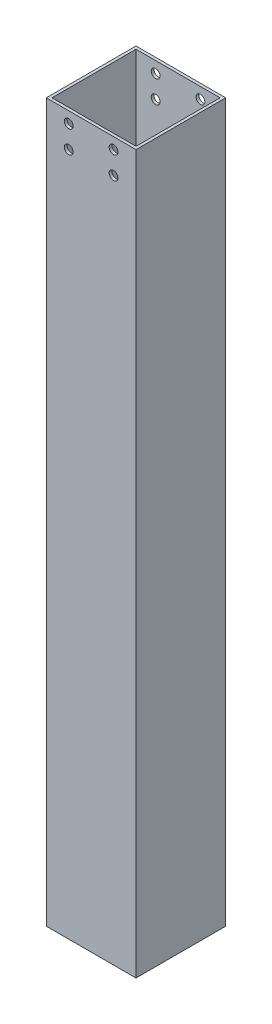
ISO-10303-21;
HEADER;
FILE_DESCRIPTION(('STEP AP214'),'2;1');
FILE_NAME('part.step','',(''),(''),'','','');
FILE_SCHEMA(('AUTOMOTIVE_DESIGN { 1 0 10303 214 1 1 1 1 }'));
ENDSEC;
DATA;
#1=APPLICATION_CONTEXT('core data for automotive mechanical design processes');
#2=APPLICATION_PROTOCOL_DEFINITION('international standard','automotive_design',2000,#1);
#3=PRODUCT_CONTEXT('',#1,'mechanical');
#4=PRODUCT('Part','Part','',(#3));
#5=PRODUCT_RELATED_PRODUCT_CATEGORY('part','',(#4));
#6=PRODUCT_DEFINITION_FORMATION('','',#4);
#7=PRODUCT_DEFINITION_CONTEXT('part definition',#1,'design');
#8=PRODUCT_DEFINITION('design','',#6,#7);
#9=PRODUCT_DEFINITION_SHAPE('','',#8);
#10=(LENGTH_UNIT() NAMED_UNIT(*) SI_UNIT(.MILLI.,.METRE.));
#11=(NAMED_UNIT(*) PLANE_ANGLE_UNIT() SI_UNIT($,.RADIAN.));
#12=(NAMED_UNIT(*) SI_UNIT($,.STERADIAN.) SOLID_ANGLE_UNIT());
#13=UNCERTAINTY_MEASURE_WITH_UNIT(LENGTH_MEASURE(1.E-05),#10,'distance_accuracy_value','');
#14=(GEOMETRIC_REPRESENTATION_CONTEXT(3) GLOBAL_UNCERTAINTY_ASSIGNED_CONTEXT((#13)) GLOBAL_UNIT_ASSIGNED_CONTEXT((#10,
#11,#12)) REPRESENTATION_CONTEXT('',''));
#15=CARTESIAN_POINT('',(0.,0.,0.));
#16=DIRECTION('',(0.,0.,1.));
#17=DIRECTION('',(1.,0.,0.));
#18=AXIS2_PLACEMENT_3D('',#15,#16,#17);
#19=CARTESIAN_POINT('',(0.,406.4,-50.8));
#20=DIRECTION('',(0.,1.,0.));
#21=DIRECTION('',(0.,0.,1.));
#22=AXIS2_PLACEMENT_3D('',#19,#20,#21);
#23=PLANE('',#22);
#24=DIRECTION('',(-1.,0.,0.));
#25=VECTOR('',#24,1.);
#26=CARTESIAN_POINT('',(0.,406.4,0.));
#27=LINE('',#26,#25);
#28=CARTESIAN_POINT('',(50.8,406.4,0.));
#29=VERTEX_POINT('',#28);
#30=CARTESIAN_POINT('',(0.,406.4,0.));
#31=VERTEX_POINT('',#30);
#32=EDGE_CURVE('E145',#29,#31,#27,.T.);
#33=ORIENTED_EDGE('',*,*,#32,.F.);
#34=DIRECTION('',(0.,0.,1.));
#35=VECTOR('',#34,1.);
#36=CARTESIAN_POINT('',(50.8,406.4,-50.8));
#37=LINE('',#36,#35);
#38=CARTESIAN_POINT('',(50.8,406.4,-50.8));
#39=VERTEX_POINT('',#38);
#40=EDGE_CURVE('E48',#39,#29,#37,.T.);
#41=ORIENTED_EDGE('',*,*,#40,.F.);
#42=DIRECTION('',(-1.,0.,0.));
#43=VECTOR('',#42,1.);
#44=CARTESIAN_POINT('',(0.,406.4,-50.8));
#45=LINE('',#44,#43);
#46=CARTESIAN_POINT('',(0.,406.4,-50.8));
#47=VERTEX_POINT('',#46);
#48=EDGE_CURVE('E151',#39,#47,#45,.T.);
#49=ORIENTED_EDGE('',*,*,#48,.T.);
#50=DIRECTION('',(0.,0.,1.));
#51=VECTOR('',#50,1.);
#52=CARTESIAN_POINT('',(0.,406.4,-50.8));
#53=LINE('',#52,#51);
#54=EDGE_CURVE('E11',#47,#31,#53,.T.);
#55=ORIENTED_EDGE('',*,*,#54,.T.);
#56=EDGE_LOOP('',(#33,#41,#49,#55));
#57=FACE_BOUND('',#56,.T.);
#58=DIRECTION('',(0.,0.,1.));
#59=VECTOR('',#58,1.);
#60=CARTESIAN_POINT('',(49.2125,406.4,-50.8));
#61=LINE('',#60,#59);
#62=CARTESIAN_POINT('',(49.2125,406.4,-49.2125));
#63=VERTEX_POINT('',#62);
#64=CARTESIAN_POINT('',(49.2125,406.4,-1.5875));
#65=VERTEX_POINT('',#64);
#66=EDGE_CURVE('E115',#63,#65,#61,.T.);
#67=ORIENTED_EDGE('',*,*,#66,.T.);
#68=DIRECTION('',(-1.,0.,0.));
#69=VECTOR('',#68,1.);
#70=CARTESIAN_POINT('',(0.,406.4,-1.5875));
#71=LINE('',#70,#69);
#72=CARTESIAN_POINT('',(1.5875,406.4,-1.5875));
#73=VERTEX_POINT('',#72);
#74=EDGE_CURVE('E121',#65,#73,#71,.T.);
#75=ORIENTED_EDGE('',*,*,#74,.T.);
#76=DIRECTION('',(0.,0.,1.));
#77=VECTOR('',#76,1.);
#78=CARTESIAN_POINT('',(1.5875,406.4,-50.8));
#79=LINE('',#78,#77);
#80=CARTESIAN_POINT('',(1.5875,406.4,-49.2125));
#81=VERTEX_POINT('',#80);
#82=EDGE_CURVE('E106',#81,#73,#79,.T.);
#83=ORIENTED_EDGE('',*,*,#82,.F.);
#84=DIRECTION('',(-1.,0.,0.));
#85=VECTOR('',#84,1.);
#86=CARTESIAN_POINT('',(0.,406.4,-49.2125));
#87=LINE('',#86,#85);
#88=EDGE_CURVE('E56',#63,#81,#87,.T.);
#89=ORIENTED_EDGE('',*,*,#88,.F.);
#90=EDGE_LOOP('',(#67,#75,#83,#89));
#91=FACE_BOUND('',#90,.T.);
#92=ADVANCED_FACE('F39',(#57,#91),#23,.T.);
#93=CARTESIAN_POINT('',(0.,0.,-50.8));
#94=DIRECTION('',(0.,-1.,0.));
#95=DIRECTION('',(0.,0.,-1.));
#96=AXIS2_PLACEMENT_3D('',#93,#94,#95);
#97=PLANE('',#96);
#98=DIRECTION('',(1.,0.,0.));
#99=VECTOR('',#98,1.);
#100=CARTESIAN_POINT('',(0.,0.,0.));
#101=LINE('',#100,#99);
#102=CARTESIAN_POINT('',(0.,0.,0.));
#103=VERTEX_POINT('',#102);
#104=CARTESIAN_POINT('',(50.8,0.,0.));
#105=VERTEX_POINT('',#104);
#106=EDGE_CURVE('E157',#103,#105,#101,.T.);
#107=ORIENTED_EDGE('',*,*,#106,.F.);
#108=DIRECTION('',(0.,0.,1.));
#109=VECTOR('',#108,1.);
#110=CARTESIAN_POINT('',(0.,0.,-50.8));
#111=LINE('',#110,#109);
#112=CARTESIAN_POINT('',(0.,0.,-50.8));
#113=VERTEX_POINT('',#112);
#114=EDGE_CURVE('E154',#113,#103,#111,.T.);
#115=ORIENTED_EDGE('',*,*,#114,.F.);
#116=DIRECTION('',(1.,0.,0.));
#117=VECTOR('',#116,1.);
#118=CARTESIAN_POINT('',(0.,0.,-50.8));
#119=LINE('',#118,#117);
#120=CARTESIAN_POINT('',(50.8,0.,-50.8));
#121=VERTEX_POINT('',#120);
#122=EDGE_CURVE('E144',#113,#121,#119,.T.);
#123=ORIENTED_EDGE('',*,*,#122,.T.);
#124=DIRECTION('',(0.,0.,1.));
#125=VECTOR('',#124,1.);
#126=CARTESIAN_POINT('',(50.8,0.,-50.8));
#127=LINE('',#126,#125);
#128=EDGE_CURVE('E166',#121,#105,#127,.T.);
#129=ORIENTED_EDGE('',*,*,#128,.T.);
#130=EDGE_LOOP('',(#107,#115,#123,#129));
#131=FACE_BOUND('',#130,.T.);
#132=DIRECTION('',(0.,0.,1.));
#133=VECTOR('',#132,1.);
#134=CARTESIAN_POINT('',(1.5875,0.,-50.8));
#135=LINE('',#134,#133);
#136=CARTESIAN_POINT('',(1.5875,0.,-49.2125));
#137=VERTEX_POINT('',#136);
#138=CARTESIAN_POINT('',(1.5875,0.,-1.5875));
#139=VERTEX_POINT('',#138);
#140=EDGE_CURVE('E135',#137,#139,#135,.T.);
#141=ORIENTED_EDGE('',*,*,#140,.T.);
#142=DIRECTION('',(1.,0.,0.));
#143=VECTOR('',#142,1.);
#144=CARTESIAN_POINT('',(0.,0.,-1.5875));
#145=LINE('',#144,#143);
#146=CARTESIAN_POINT('',(49.2125,0.,-1.5875));
#147=VERTEX_POINT('',#146);
#148=EDGE_CURVE('E124',#139,#147,#145,.T.);
#149=ORIENTED_EDGE('',*,*,#148,.T.);
#150=DIRECTION('',(0.,0.,1.));
#151=VECTOR('',#150,1.);
#152=CARTESIAN_POINT('',(49.2125,0.,-50.8));
#153=LINE('',#152,#151);
#154=CARTESIAN_POINT('',(49.2125,0.,-49.2125));
#155=VERTEX_POINT('',#154);
#156=EDGE_CURVE('E133',#155,#147,#153,.T.);
#157=ORIENTED_EDGE('',*,*,#156,.F.);
#158=DIRECTION('',(1.,0.,0.));
#159=VECTOR('',#158,1.);
#160=CARTESIAN_POINT('',(0.,0.,-49.2125));
#161=LINE('',#160,#159);
#162=EDGE_CURVE('E61',#137,#155,#161,.T.);
#163=ORIENTED_EDGE('',*,*,#162,.F.);
#164=EDGE_LOOP('',(#141,#149,#157,#163));
#165=FACE_BOUND('',#164,.T.);
#166=ADVANCED_FACE('F198',(#131,#165),#97,.T.);
#167=CARTESIAN_POINT('',(0.,0.,-50.8));
#168=DIRECTION('',(-1.,0.,0.));
#169=DIRECTION('',(0.,0.,1.));
#170=AXIS2_PLACEMENT_3D('',#167,#168,#169);
#171=PLANE('',#170);
#172=DIRECTION('',(0.,-1.,0.));
#173=VECTOR('',#172,1.);
#174=CARTESIAN_POINT('',(0.,0.,0.));
#175=LINE('',#174,#173);
#176=EDGE_CURVE('E114',#31,#103,#175,.T.);
#177=ORIENTED_EDGE('',*,*,#176,.F.);
#178=ORIENTED_EDGE('',*,*,#54,.F.);
#179=DIRECTION('',(0.,-1.,0.));
#180=VECTOR('',#179,1.);
#181=CARTESIAN_POINT('',(0.,0.,-50.8));
#182=LINE('',#181,#180);
#183=EDGE_CURVE('E141',#47,#113,#182,.T.);
#184=ORIENTED_EDGE('',*,*,#183,.T.);
#185=ORIENTED_EDGE('',*,*,#114,.T.);
#186=EDGE_LOOP('',(#177,#178,#184,#185));
#187=FACE_BOUND('',#186,.T.);
#188=ADVANCED_FACE('F41',(#187),#171,.T.);
#189=CARTESIAN_POINT('',(50.8,0.,-50.8));
#190=DIRECTION('',(1.,0.,0.));
#191=DIRECTION('',(0.,0.,-1.));
#192=AXIS2_PLACEMENT_3D('',#189,#190,#191);
#193=PLANE('',#192);
#194=DIRECTION('',(0.,1.,0.));
#195=VECTOR('',#194,1.);
#196=CARTESIAN_POINT('',(50.8,0.,0.));
#197=LINE('',#196,#195);
#198=EDGE_CURVE('E160',#105,#29,#197,.T.);
#199=ORIENTED_EDGE('',*,*,#198,.F.);
#200=ORIENTED_EDGE('',*,*,#128,.F.);
#201=DIRECTION('',(0.,1.,0.));
#202=VECTOR('',#201,1.);
#203=CARTESIAN_POINT('',(50.8,0.,-50.8));
#204=LINE('',#203,#202);
#205=EDGE_CURVE('E148',#121,#39,#204,.T.);
#206=ORIENTED_EDGE('',*,*,#205,.T.);
#207=ORIENTED_EDGE('',*,*,#40,.T.);
#208=EDGE_LOOP('',(#199,#200,#206,#207));
#209=FACE_BOUND('',#208,.T.);
#210=ADVANCED_FACE('F205',(#209),#193,.T.);
#211=CARTESIAN_POINT('',(0.,0.,-50.8));
#212=DIRECTION('',(0.,0.,-1.));
#213=DIRECTION('',(-1.,0.,0.));
#214=AXIS2_PLACEMENT_3D('',#211,#212,#213);
#215=PLANE('',#214);
#216=CARTESIAN_POINT('',(12.7,387.35,-50.8));
#217=DIRECTION('',(0.,0.,1.));
#218=DIRECTION('',(1.,0.,0.));
#219=AXIS2_PLACEMENT_3D('',#216,#217,#218);
#220=CIRCLE('',#219,2.48920000000001);
#221=CARTESIAN_POINT('',(15.1892,387.35,-50.8));
#222=VERTEX_POINT('',#221);
#223=EDGE_CURVE('E281',#222,#222,#220,.T.);
#224=ORIENTED_EDGE('',*,*,#223,.T.);
#225=EDGE_LOOP('',(#224));
#226=FACE_BOUND('',#225,.T.);
#227=CARTESIAN_POINT('',(12.7,400.05,-50.8));
#228=DIRECTION('',(0.,0.,1.));
#229=DIRECTION('',(1.,0.,0.));
#230=AXIS2_PLACEMENT_3D('',#227,#228,#229);
#231=CIRCLE('',#230,2.48919999999998);
#232=CARTESIAN_POINT('',(15.1892,400.05,-50.8));
#233=VERTEX_POINT('',#232);
#234=EDGE_CURVE('E273',#233,#233,#231,.T.);
#235=ORIENTED_EDGE('',*,*,#234,.T.);
#236=EDGE_LOOP('',(#235));
#237=FACE_BOUND('',#236,.T.);
#238=CARTESIAN_POINT('',(38.1,400.05,-50.8));
#239=DIRECTION('',(0.,0.,1.));
#240=DIRECTION('',(1.,0.,0.));
#241=AXIS2_PLACEMENT_3D('',#238,#239,#240);
#242=CIRCLE('',#241,2.48919999999997);
#243=CARTESIAN_POINT('',(40.5892,400.05,-50.8));
#244=VERTEX_POINT('',#243);
#245=EDGE_CURVE('E264',#244,#244,#242,.T.);
#246=ORIENTED_EDGE('',*,*,#245,.T.);
#247=EDGE_LOOP('',(#246));
#248=FACE_BOUND('',#247,.T.);
#249=CARTESIAN_POINT('',(38.1,387.35,-50.8));
#250=DIRECTION('',(0.,0.,1.));
#251=DIRECTION('',(1.,0.,0.));
#252=AXIS2_PLACEMENT_3D('',#249,#250,#251);
#253=CIRCLE('',#252,2.4892);
#254=CARTESIAN_POINT('',(40.5892,387.35,-50.8));
#255=VERTEX_POINT('',#254);
#256=EDGE_CURVE('E173',#255,#255,#253,.T.);
#257=ORIENTED_EDGE('',*,*,#256,.T.);
#258=EDGE_LOOP('',(#257));
#259=FACE_BOUND('',#258,.T.);
#260=ORIENTED_EDGE('',*,*,#183,.F.);
#261=ORIENTED_EDGE('',*,*,#48,.F.);
#262=ORIENTED_EDGE('',*,*,#205,.F.);
#263=ORIENTED_EDGE('',*,*,#122,.F.);
#264=EDGE_LOOP('',(#260,#261,#262,#263));
#265=FACE_BOUND('',#264,.T.);
#266=ADVANCED_FACE('F212',(#226,#237,#248,#259,#265),#215,.T.);
#267=CARTESIAN_POINT('',(0.,0.,0.));
#268=DIRECTION('',(0.,0.,-1.));
#269=DIRECTION('',(-1.,0.,0.));
#270=AXIS2_PLACEMENT_3D('',#267,#268,#269);
#271=PLANE('',#270);
#272=CARTESIAN_POINT('',(12.7,387.35,0.));
#273=DIRECTION('',(0.,0.,1.));
#274=DIRECTION('',(1.,0.,0.));
#275=AXIS2_PLACEMENT_3D('',#272,#273,#274);
#276=CIRCLE('',#275,2.48920000000001);
#277=CARTESIAN_POINT('',(15.1892,387.35,0.));
#278=VERTEX_POINT('',#277);
#279=EDGE_CURVE('E278',#278,#278,#276,.T.);
#280=ORIENTED_EDGE('',*,*,#279,.F.);
#281=EDGE_LOOP('',(#280));
#282=FACE_BOUND('',#281,.T.);
#283=CARTESIAN_POINT('',(12.7,400.05,0.));
#284=DIRECTION('',(0.,0.,1.));
#285=DIRECTION('',(1.,0.,0.));
#286=AXIS2_PLACEMENT_3D('',#283,#284,#285);
#287=CIRCLE('',#286,2.48919999999998);
#288=CARTESIAN_POINT('',(15.1892,400.05,0.));
#289=VERTEX_POINT('',#288);
#290=EDGE_CURVE('E267',#289,#289,#287,.T.);
#291=ORIENTED_EDGE('',*,*,#290,.F.);
#292=EDGE_LOOP('',(#291));
#293=FACE_BOUND('',#292,.T.);
#294=CARTESIAN_POINT('',(38.1,400.05,0.));
#295=DIRECTION('',(0.,0.,1.));
#296=DIRECTION('',(1.,0.,0.));
#297=AXIS2_PLACEMENT_3D('',#294,#295,#296);
#298=CIRCLE('',#297,2.48919999999997);
#299=CARTESIAN_POINT('',(40.5892,400.05,0.));
#300=VERTEX_POINT('',#299);
#301=EDGE_CURVE('E266',#300,#300,#298,.T.);
#302=ORIENTED_EDGE('',*,*,#301,.F.);
#303=EDGE_LOOP('',(#302));
#304=FACE_BOUND('',#303,.T.);
#305=CARTESIAN_POINT('',(38.1,387.35,0.));
#306=DIRECTION('',(0.,0.,1.));
#307=DIRECTION('',(1.,0.,0.));
#308=AXIS2_PLACEMENT_3D('',#305,#306,#307);
#309=CIRCLE('',#308,2.4892);
#310=CARTESIAN_POINT('',(40.5892,387.35,0.));
#311=VERTEX_POINT('',#310);
#312=EDGE_CURVE('E270',#311,#311,#309,.T.);
#313=ORIENTED_EDGE('',*,*,#312,.F.);
#314=EDGE_LOOP('',(#313));
#315=FACE_BOUND('',#314,.T.);
#316=ORIENTED_EDGE('',*,*,#176,.T.);
#317=ORIENTED_EDGE('',*,*,#106,.T.);
#318=ORIENTED_EDGE('',*,*,#198,.T.);
#319=ORIENTED_EDGE('',*,*,#32,.T.);
#320=EDGE_LOOP('',(#316,#317,#318,#319));
#321=FACE_BOUND('',#320,.T.);
#322=ADVANCED_FACE('F215',(#282,#293,#304,#315,#321),#271,.F.);
#323=CARTESIAN_POINT('',(1.5875,0.,-50.8));
#324=DIRECTION('',(-1.,0.,0.));
#325=DIRECTION('',(0.,0.,1.));
#326=AXIS2_PLACEMENT_3D('',#323,#324,#325);
#327=PLANE('',#326);
#328=DIRECTION('',(0.,-1.,0.));
#329=VECTOR('',#328,1.);
#330=CARTESIAN_POINT('',(1.5875,0.,-1.5875));
#331=LINE('',#330,#329);
#332=EDGE_CURVE('E109',#73,#139,#331,.T.);
#333=ORIENTED_EDGE('',*,*,#332,.T.);
#334=ORIENTED_EDGE('',*,*,#140,.F.);
#335=DIRECTION('',(0.,-1.,0.));
#336=VECTOR('',#335,1.);
#337=CARTESIAN_POINT('',(1.5875,0.,-49.2125));
#338=LINE('',#337,#336);
#339=EDGE_CURVE('E111',#81,#137,#338,.T.);
#340=ORIENTED_EDGE('',*,*,#339,.F.);
#341=ORIENTED_EDGE('',*,*,#82,.T.);
#342=EDGE_LOOP('',(#333,#334,#340,#341));
#343=FACE_BOUND('',#342,.T.);
#344=ADVANCED_FACE('F108',(#343),#327,.F.);
#345=CARTESIAN_POINT('',(49.2125,0.,-50.8));
#346=DIRECTION('',(1.,0.,0.));
#347=DIRECTION('',(0.,0.,-1.));
#348=AXIS2_PLACEMENT_3D('',#345,#346,#347);
#349=PLANE('',#348);
#350=DIRECTION('',(0.,1.,0.));
#351=VECTOR('',#350,1.);
#352=CARTESIAN_POINT('',(49.2125,0.,-1.5875));
#353=LINE('',#352,#351);
#354=EDGE_CURVE('E127',#147,#65,#353,.T.);
#355=ORIENTED_EDGE('',*,*,#354,.T.);
#356=ORIENTED_EDGE('',*,*,#66,.F.);
#357=DIRECTION('',(0.,1.,0.));
#358=VECTOR('',#357,1.);
#359=CARTESIAN_POINT('',(49.2125,0.,-49.2125));
#360=LINE('',#359,#358);
#361=EDGE_CURVE('E136',#155,#63,#360,.T.);
#362=ORIENTED_EDGE('',*,*,#361,.F.);
#363=ORIENTED_EDGE('',*,*,#156,.T.);
#364=EDGE_LOOP('',(#355,#356,#362,#363));
#365=FACE_BOUND('',#364,.T.);
#366=ADVANCED_FACE('F196',(#365),#349,.F.);
#367=CARTESIAN_POINT('',(0.,0.,-49.2125));
#368=DIRECTION('',(0.,0.,-1.));
#369=DIRECTION('',(-1.,0.,0.));
#370=AXIS2_PLACEMENT_3D('',#367,#368,#369);
#371=PLANE('',#370);
#372=CARTESIAN_POINT('',(12.7,387.35,-49.2125));
#373=DIRECTION('',(0.,0.,-1.));
#374=DIRECTION('',(-1.,0.,0.));
#375=AXIS2_PLACEMENT_3D('',#372,#373,#374);
#376=CIRCLE('',#375,2.48920000000001);
#377=CARTESIAN_POINT('',(10.2108,387.35,-49.2125));
#378=VERTEX_POINT('',#377);
#379=EDGE_CURVE('E125',#378,#378,#376,.T.);
#380=ORIENTED_EDGE('',*,*,#379,.T.);
#381=EDGE_LOOP('',(#380));
#382=FACE_BOUND('',#381,.T.);
#383=CARTESIAN_POINT('',(12.7,400.05,-49.2125));
#384=DIRECTION('',(0.,0.,-1.));
#385=DIRECTION('',(-1.,0.,0.));
#386=AXIS2_PLACEMENT_3D('',#383,#384,#385);
#387=CIRCLE('',#386,2.48919999999998);
#388=CARTESIAN_POINT('',(10.2108,400.05,-49.2125));
#389=VERTEX_POINT('',#388);
#390=EDGE_CURVE('E179',#389,#389,#387,.T.);
#391=ORIENTED_EDGE('',*,*,#390,.T.);
#392=EDGE_LOOP('',(#391));
#393=FACE_BOUND('',#392,.T.);
#394=CARTESIAN_POINT('',(38.1,400.05,-49.2125));
#395=DIRECTION('',(0.,0.,-1.));
#396=DIRECTION('',(-1.,0.,0.));
#397=AXIS2_PLACEMENT_3D('',#394,#395,#396);
#398=CIRCLE('',#397,2.48919999999997);
#399=CARTESIAN_POINT('',(35.6108,400.05,-49.2125));
#400=VERTEX_POINT('',#399);
#401=EDGE_CURVE('E176',#400,#400,#398,.T.);
#402=ORIENTED_EDGE('',*,*,#401,.T.);
#403=EDGE_LOOP('',(#402));
#404=FACE_BOUND('',#403,.T.);
#405=CARTESIAN_POINT('',(38.1,387.35,-49.2125));
#406=DIRECTION('',(0.,0.,-1.));
#407=DIRECTION('',(-1.,0.,0.));
#408=AXIS2_PLACEMENT_3D('',#405,#406,#407);
#409=CIRCLE('',#408,2.4892);
#410=CARTESIAN_POINT('',(35.6108,387.35,-49.2125));
#411=VERTEX_POINT('',#410);
#412=EDGE_CURVE('E172',#411,#411,#409,.T.);
#413=ORIENTED_EDGE('',*,*,#412,.T.);
#414=EDGE_LOOP('',(#413));
#415=FACE_BOUND('',#414,.T.);
#416=ORIENTED_EDGE('',*,*,#339,.T.);
#417=ORIENTED_EDGE('',*,*,#162,.T.);
#418=ORIENTED_EDGE('',*,*,#361,.T.);
#419=ORIENTED_EDGE('',*,*,#88,.T.);
#420=EDGE_LOOP('',(#416,#417,#418,#419));
#421=FACE_BOUND('',#420,.T.);
#422=ADVANCED_FACE('F193',(#382,#393,#404,#415,#421),#371,.F.);
#423=CARTESIAN_POINT('',(0.,0.,-1.5875));
#424=DIRECTION('',(0.,0.,-1.));
#425=DIRECTION('',(-1.,0.,0.));
#426=AXIS2_PLACEMENT_3D('',#423,#424,#425);
#427=PLANE('',#426);
#428=CARTESIAN_POINT('',(12.7,387.35,-1.5875));
#429=DIRECTION('',(0.,0.,-1.));
#430=DIRECTION('',(-1.,0.,0.));
#431=AXIS2_PLACEMENT_3D('',#428,#429,#430);
#432=CIRCLE('',#431,2.48920000000001);
#433=CARTESIAN_POINT('',(10.2108,387.35,-1.5875));
#434=VERTEX_POINT('',#433);
#435=EDGE_CURVE('E43',#434,#434,#432,.T.);
#436=ORIENTED_EDGE('',*,*,#435,.F.);
#437=EDGE_LOOP('',(#436));
#438=FACE_BOUND('',#437,.T.);
#439=CARTESIAN_POINT('',(12.7,400.05,-1.5875));
#440=DIRECTION('',(0.,0.,-1.));
#441=DIRECTION('',(-1.,0.,0.));
#442=AXIS2_PLACEMENT_3D('',#439,#440,#441);
#443=CIRCLE('',#442,2.48919999999998);
#444=CARTESIAN_POINT('',(10.2108,400.05,-1.5875));
#445=VERTEX_POINT('',#444);
#446=EDGE_CURVE('E177',#445,#445,#443,.T.);
#447=ORIENTED_EDGE('',*,*,#446,.F.);
#448=EDGE_LOOP('',(#447));
#449=FACE_BOUND('',#448,.T.);
#450=CARTESIAN_POINT('',(38.1,400.05,-1.5875));
#451=DIRECTION('',(0.,0.,-1.));
#452=DIRECTION('',(-1.,0.,0.));
#453=AXIS2_PLACEMENT_3D('',#450,#451,#452);
#454=CIRCLE('',#453,2.48919999999997);
#455=CARTESIAN_POINT('',(35.6108,400.05,-1.5875));
#456=VERTEX_POINT('',#455);
#457=EDGE_CURVE('E174',#456,#456,#454,.T.);
#458=ORIENTED_EDGE('',*,*,#457,.F.);
#459=EDGE_LOOP('',(#458));
#460=FACE_BOUND('',#459,.T.);
#461=CARTESIAN_POINT('',(38.1,387.35,-1.5875));
#462=DIRECTION('',(0.,0.,-1.));
#463=DIRECTION('',(-1.,0.,0.));
#464=AXIS2_PLACEMENT_3D('',#461,#462,#463);
#465=CIRCLE('',#464,2.4892);
#466=CARTESIAN_POINT('',(35.6108,387.35,-1.5875));
#467=VERTEX_POINT('',#466);
#468=EDGE_CURVE('E169',#467,#467,#465,.T.);
#469=ORIENTED_EDGE('',*,*,#468,.F.);
#470=EDGE_LOOP('',(#469));
#471=FACE_BOUND('',#470,.T.);
#472=ORIENTED_EDGE('',*,*,#332,.F.);
#473=ORIENTED_EDGE('',*,*,#74,.F.);
#474=ORIENTED_EDGE('',*,*,#354,.F.);
#475=ORIENTED_EDGE('',*,*,#148,.F.);
#476=EDGE_LOOP('',(#472,#473,#474,#475));
#477=FACE_BOUND('',#476,.T.);
#478=ADVANCED_FACE('F119',(#438,#449,#460,#471,#477),#427,.T.);
#479=CARTESIAN_POINT('',(38.1,387.35,-50.8));
#480=DIRECTION('',(0.,0.,1.));
#481=DIRECTION('',(1.,0.,0.));
#482=AXIS2_PLACEMENT_3D('',#479,#480,#481);
#483=CYLINDRICAL_SURFACE('',#482,2.4892);
#484=ORIENTED_EDGE('',*,*,#468,.T.);
#485=EDGE_LOOP('',(#484));
#486=FACE_BOUND('',#485,.T.);
#487=ORIENTED_EDGE('',*,*,#312,.T.);
#488=EDGE_LOOP('',(#487));
#489=FACE_BOUND('',#488,.T.);
#490=ADVANCED_FACE('F224',(#486,#489),#483,.F.);
#491=CARTESIAN_POINT('',(38.1,400.05,-50.8));
#492=DIRECTION('',(0.,0.,1.));
#493=DIRECTION('',(1.,0.,0.));
#494=AXIS2_PLACEMENT_3D('',#491,#492,#493);
#495=CYLINDRICAL_SURFACE('',#494,2.48919999999997);
#496=ORIENTED_EDGE('',*,*,#457,.T.);
#497=EDGE_LOOP('',(#496));
#498=FACE_BOUND('',#497,.T.);
#499=ORIENTED_EDGE('',*,*,#301,.T.);
#500=EDGE_LOOP('',(#499));
#501=FACE_BOUND('',#500,.T.);
#502=ADVANCED_FACE('F235',(#498,#501),#495,.F.);
#503=CARTESIAN_POINT('',(12.7,400.05,-50.8));
#504=DIRECTION('',(0.,0.,1.));
#505=DIRECTION('',(1.,0.,0.));
#506=AXIS2_PLACEMENT_3D('',#503,#504,#505);
#507=CYLINDRICAL_SURFACE('',#506,2.48919999999998);
#508=ORIENTED_EDGE('',*,*,#446,.T.);
#509=EDGE_LOOP('',(#508));
#510=FACE_BOUND('',#509,.T.);
#511=ORIENTED_EDGE('',*,*,#290,.T.);
#512=EDGE_LOOP('',(#511));
#513=FACE_BOUND('',#512,.T.);
#514=ADVANCED_FACE('F241',(#510,#513),#507,.F.);
#515=CARTESIAN_POINT('',(12.7,387.35,-50.8));
#516=DIRECTION('',(0.,0.,1.));
#517=DIRECTION('',(1.,0.,0.));
#518=AXIS2_PLACEMENT_3D('',#515,#516,#517);
#519=CYLINDRICAL_SURFACE('',#518,2.48920000000001);
#520=ORIENTED_EDGE('',*,*,#435,.T.);
#521=EDGE_LOOP('',(#520));
#522=FACE_BOUND('',#521,.T.);
#523=ORIENTED_EDGE('',*,*,#279,.T.);
#524=EDGE_LOOP('',(#523));
#525=FACE_BOUND('',#524,.T.);
#526=ADVANCED_FACE('F238',(#522,#525),#519,.F.);
#527=ORIENTED_EDGE('',*,*,#256,.F.);
#528=EDGE_LOOP('',(#527));
#529=FACE_BOUND('',#528,.T.);
#530=ORIENTED_EDGE('',*,*,#412,.F.);
#531=EDGE_LOOP('',(#530));
#532=FACE_BOUND('',#531,.T.);
#533=ADVANCED_FACE('F237',(#529,#532),#483,.F.);
#534=ORIENTED_EDGE('',*,*,#245,.F.);
#535=EDGE_LOOP('',(#534));
#536=FACE_BOUND('',#535,.T.);
#537=ORIENTED_EDGE('',*,*,#401,.F.);
#538=EDGE_LOOP('',(#537));
#539=FACE_BOUND('',#538,.T.);
#540=ADVANCED_FACE('F249',(#536,#539),#495,.F.);
#541=ORIENTED_EDGE('',*,*,#234,.F.);
#542=EDGE_LOOP('',(#541));
#543=FACE_BOUND('',#542,.T.);
#544=ORIENTED_EDGE('',*,*,#390,.F.);
#545=EDGE_LOOP('',(#544));
#546=FACE_BOUND('',#545,.T.);
#547=ADVANCED_FACE('F246',(#543,#546),#507,.F.);
#548=ORIENTED_EDGE('',*,*,#223,.F.);
#549=EDGE_LOOP('',(#548));
#550=FACE_BOUND('',#549,.T.);
#551=ORIENTED_EDGE('',*,*,#379,.F.);
#552=EDGE_LOOP('',(#551));
#553=FACE_BOUND('',#552,.T.);
#554=ADVANCED_FACE('F243',(#550,#553),#519,.F.);
#555=CLOSED_SHELL('',(#92,#166,#188,#210,#266,#322,#344,#366,#422,#478,#490,#502,#514,#526,#533,
#540,#547,#554));
#556=MANIFOLD_SOLID_BREP('B2',#555);
#557=ADVANCED_BREP_SHAPE_REPRESENTATION('',(#18,#556),#14);
#558=SHAPE_DEFINITION_REPRESENTATION(#9,#557);
ENDSEC;
END-ISO-10303-21;
